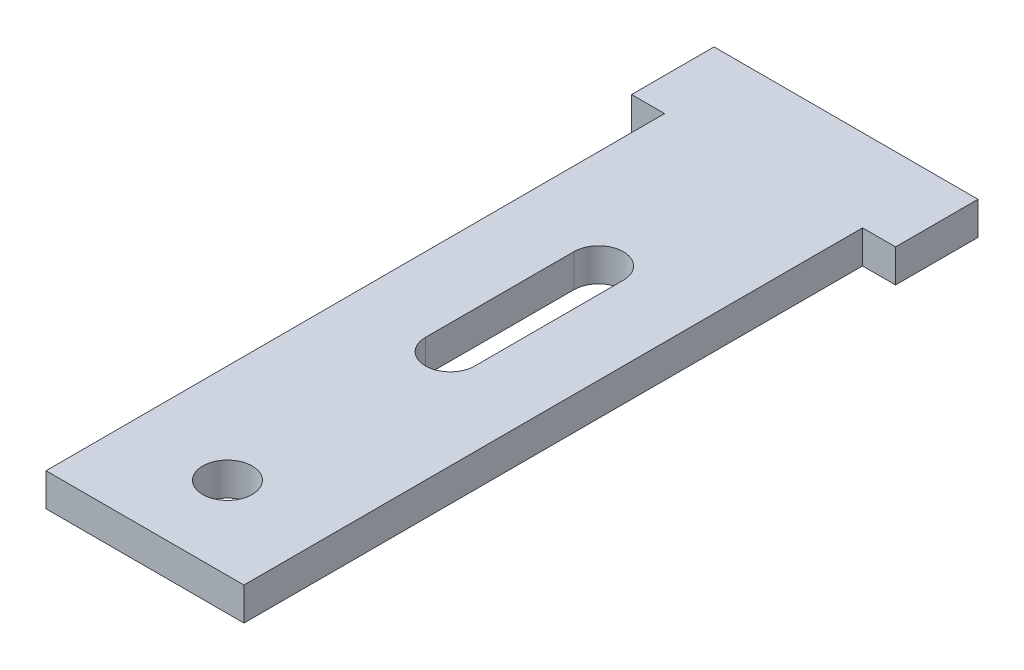
ISO-10303-21;
HEADER;
FILE_DESCRIPTION(('STEP AP214'),'2;1');
FILE_NAME('part.step','',(''),(''),'','','');
FILE_SCHEMA(('AUTOMOTIVE_DESIGN { 1 0 10303 214 1 1 1 1 }'));
ENDSEC;
DATA;
#1=APPLICATION_CONTEXT('core data for automotive mechanical design processes');
#2=APPLICATION_PROTOCOL_DEFINITION('international standard','automotive_design',2000,#1);
#3=PRODUCT_CONTEXT('',#1,'mechanical');
#4=PRODUCT('Part','Part','',(#3));
#5=PRODUCT_RELATED_PRODUCT_CATEGORY('part','',(#4));
#6=PRODUCT_DEFINITION_FORMATION('','',#4);
#7=PRODUCT_DEFINITION_CONTEXT('part definition',#1,'design');
#8=PRODUCT_DEFINITION('design','',#6,#7);
#9=PRODUCT_DEFINITION_SHAPE('','',#8);
#10=(LENGTH_UNIT() NAMED_UNIT(*) SI_UNIT(.MILLI.,.METRE.));
#11=(NAMED_UNIT(*) PLANE_ANGLE_UNIT() SI_UNIT($,.RADIAN.));
#12=(NAMED_UNIT(*) SI_UNIT($,.STERADIAN.) SOLID_ANGLE_UNIT());
#13=UNCERTAINTY_MEASURE_WITH_UNIT(LENGTH_MEASURE(1.E-05),#10,'distance_accuracy_value','');
#14=(GEOMETRIC_REPRESENTATION_CONTEXT(3) GLOBAL_UNCERTAINTY_ASSIGNED_CONTEXT((#13)) GLOBAL_UNIT_ASSIGNED_CONTEXT((#10,
#11,#12)) REPRESENTATION_CONTEXT('',''));
#15=CARTESIAN_POINT('',(0.,0.,0.));
#16=DIRECTION('',(0.,0.,1.));
#17=DIRECTION('',(1.,0.,0.));
#18=AXIS2_PLACEMENT_3D('',#15,#16,#17);
#19=CARTESIAN_POINT('',(0.,2.,0.));
#20=DIRECTION('',(0.,1.,0.));
#21=DIRECTION('',(0.,0.,1.));
#22=AXIS2_PLACEMENT_3D('',#19,#20,#21);
#23=PLANE('',#22);
#24=DIRECTION('',(0.,0.,1.));
#25=VECTOR('',#24,1.);
#26=CARTESIAN_POINT('',(-5.99999999999999,2.,15.7643000732223));
#27=LINE('',#26,#25);
#28=CARTESIAN_POINT('',(-5.99999999999998,2.,-21.7356999267777));
#29=VERTEX_POINT('',#28);
#30=CARTESIAN_POINT('',(-5.99999999999999,2.,15.7643000732223));
#31=VERTEX_POINT('',#30);
#32=EDGE_CURVE('E166',#29,#31,#27,.T.);
#33=ORIENTED_EDGE('',*,*,#32,.T.);
#34=DIRECTION('',(1.,0.,0.));
#35=VECTOR('',#34,1.);
#36=CARTESIAN_POINT('',(6.00000000000002,2.,15.7643000732223));
#37=LINE('',#36,#35);
#38=CARTESIAN_POINT('',(6.00000000000002,2.,15.7643000732223));
#39=VERTEX_POINT('',#38);
#40=EDGE_CURVE('E169',#31,#39,#37,.T.);
#41=ORIENTED_EDGE('',*,*,#40,.T.);
#42=DIRECTION('',(0.,0.,-1.));
#43=VECTOR('',#42,1.);
#44=CARTESIAN_POINT('',(6.00000000000002,2.,15.7643000732223));
#45=LINE('',#44,#43);
#46=CARTESIAN_POINT('',(6.00000000000001,2.,-21.7356999267777));
#47=VERTEX_POINT('',#46);
#48=EDGE_CURVE('E172',#39,#47,#45,.T.);
#49=ORIENTED_EDGE('',*,*,#48,.T.);
#50=DIRECTION('',(1.,0.,0.));
#51=VECTOR('',#50,1.);
#52=CARTESIAN_POINT('',(8.00000000000001,2.,-21.7356999267777));
#53=LINE('',#52,#51);
#54=CARTESIAN_POINT('',(8.00000000000001,2.,-21.7356999267777));
#55=VERTEX_POINT('',#54);
#56=EDGE_CURVE('E174',#47,#55,#53,.T.);
#57=ORIENTED_EDGE('',*,*,#56,.T.);
#58=DIRECTION('',(0.,0.,-1.));
#59=VECTOR('',#58,1.);
#60=CARTESIAN_POINT('',(8.00000000000001,2.,-26.7356999267777));
#61=LINE('',#60,#59);
#62=CARTESIAN_POINT('',(8.00000000000001,2.,-26.7356999267777));
#63=VERTEX_POINT('',#62);
#64=EDGE_CURVE('E176',#55,#63,#61,.T.);
#65=ORIENTED_EDGE('',*,*,#64,.T.);
#66=DIRECTION('',(-1.,0.,0.));
#67=VECTOR('',#66,1.);
#68=CARTESIAN_POINT('',(-7.99999999999999,2.,-26.7356999267777));
#69=LINE('',#68,#67);
#70=CARTESIAN_POINT('',(-7.99999999999999,2.,-26.7356999267777));
#71=VERTEX_POINT('',#70);
#72=EDGE_CURVE('E178',#63,#71,#69,.T.);
#73=ORIENTED_EDGE('',*,*,#72,.T.);
#74=DIRECTION('',(0.,0.,1.));
#75=VECTOR('',#74,1.);
#76=CARTESIAN_POINT('',(-7.99999999999999,2.,-21.7356999267777));
#77=LINE('',#76,#75);
#78=CARTESIAN_POINT('',(-7.99999999999999,2.,-21.7356999267777));
#79=VERTEX_POINT('',#78);
#80=EDGE_CURVE('E180',#71,#79,#77,.T.);
#81=ORIENTED_EDGE('',*,*,#80,.T.);
#82=DIRECTION('',(1.,0.,0.));
#83=VECTOR('',#82,1.);
#84=CARTESIAN_POINT('',(-5.99999999999998,2.,-21.7356999267777));
#85=LINE('',#84,#83);
#86=EDGE_CURVE('E182',#79,#29,#85,.T.);
#87=ORIENTED_EDGE('',*,*,#86,.T.);
#88=EDGE_LOOP('',(#33,#41,#49,#57,#65,#73,#81,#87));
#89=FACE_BOUND('',#88,.T.);
#90=CARTESIAN_POINT('',(0.,2.,10.7643000732223));
#91=DIRECTION('',(0.,1.,0.));
#92=DIRECTION('',(0.,0.,1.));
#93=AXIS2_PLACEMENT_3D('',#90,#91,#92);
#94=CIRCLE('',#93,1.5);
#95=CARTESIAN_POINT('',(0.,2.,12.2643000732223));
#96=VERTEX_POINT('',#95);
#97=EDGE_CURVE('E160',#96,#96,#94,.T.);
#98=ORIENTED_EDGE('',*,*,#97,.F.);
#99=EDGE_LOOP('',(#98));
#100=FACE_BOUND('',#99,.T.);
#101=DIRECTION('',(0.,0.,1.));
#102=VECTOR('',#101,1.);
#103=CARTESIAN_POINT('',(-1.5,2.,-2.73569992677766));
#104=LINE('',#103,#102);
#105=CARTESIAN_POINT('',(-1.5,2.,-11.7356999267777));
#106=VERTEX_POINT('',#105);
#107=CARTESIAN_POINT('',(-1.5,2.,-2.73569992677766));
#108=VERTEX_POINT('',#107);
#109=EDGE_CURVE('E132',#106,#108,#104,.T.);
#110=ORIENTED_EDGE('',*,*,#109,.F.);
#111=CARTESIAN_POINT('',(0.,2.,-11.7356999267777));
#112=DIRECTION('',(0.,1.,0.));
#113=DIRECTION('',(0.,0.,-1.));
#114=AXIS2_PLACEMENT_3D('',#111,#112,#113);
#115=CIRCLE('',#114,1.5);
#116=CARTESIAN_POINT('',(1.5,2.,-11.7356999267777));
#117=VERTEX_POINT('',#116);
#118=EDGE_CURVE('E124',#117,#106,#115,.T.);
#119=ORIENTED_EDGE('',*,*,#118,.F.);
#120=DIRECTION('',(0.,0.,-1.));
#121=VECTOR('',#120,1.);
#122=CARTESIAN_POINT('',(1.5,2.,-2.73569992677766));
#123=LINE('',#122,#121);
#124=CARTESIAN_POINT('',(1.5,2.,-2.73569992677766));
#125=VERTEX_POINT('',#124);
#126=EDGE_CURVE('E146',#125,#117,#123,.T.);
#127=ORIENTED_EDGE('',*,*,#126,.F.);
#128=CARTESIAN_POINT('',(0.,2.,-2.73569992677766));
#129=DIRECTION('',(0.,1.,0.));
#130=DIRECTION('',(0.,0.,1.));
#131=AXIS2_PLACEMENT_3D('',#128,#129,#130);
#132=CIRCLE('',#131,1.5);
#133=EDGE_CURVE('E144',#108,#125,#132,.T.);
#134=ORIENTED_EDGE('',*,*,#133,.F.);
#135=EDGE_LOOP('',(#110,#119,#127,#134));
#136=FACE_BOUND('',#135,.T.);
#137=ADVANCED_FACE('F35',(#89,#100,#136),#23,.T.);
#138=CARTESIAN_POINT('',(0.,0.,0.));
#139=DIRECTION('',(0.,1.,0.));
#140=DIRECTION('',(0.,0.,1.));
#141=AXIS2_PLACEMENT_3D('',#138,#139,#140);
#142=PLANE('',#141);
#143=CARTESIAN_POINT('',(0.,0.,10.7643000732223));
#144=DIRECTION('',(0.,1.,0.));
#145=DIRECTION('',(0.,0.,1.));
#146=AXIS2_PLACEMENT_3D('',#143,#144,#145);
#147=CIRCLE('',#146,1.5);
#148=CARTESIAN_POINT('',(0.,0.,12.2643000732223));
#149=VERTEX_POINT('',#148);
#150=EDGE_CURVE('E140',#149,#149,#147,.T.);
#151=ORIENTED_EDGE('',*,*,#150,.T.);
#152=EDGE_LOOP('',(#151));
#153=FACE_BOUND('',#152,.T.);
#154=DIRECTION('',(0.,0.,1.));
#155=VECTOR('',#154,1.);
#156=CARTESIAN_POINT('',(-5.99999999999999,0.,15.7643000732223));
#157=LINE('',#156,#155);
#158=CARTESIAN_POINT('',(-5.99999999999998,0.,-21.7356999267777));
#159=VERTEX_POINT('',#158);
#160=CARTESIAN_POINT('',(-5.99999999999999,0.,15.7643000732223));
#161=VERTEX_POINT('',#160);
#162=EDGE_CURVE('E163',#159,#161,#157,.T.);
#163=ORIENTED_EDGE('',*,*,#162,.F.);
#164=DIRECTION('',(1.,0.,0.));
#165=VECTOR('',#164,1.);
#166=CARTESIAN_POINT('',(-5.99999999999998,0.,-21.7356999267777));
#167=LINE('',#166,#165);
#168=CARTESIAN_POINT('',(-7.99999999999999,0.,-21.7356999267777));
#169=VERTEX_POINT('',#168);
#170=EDGE_CURVE('E170',#169,#159,#167,.T.);
#171=ORIENTED_EDGE('',*,*,#170,.F.);
#172=DIRECTION('',(0.,0.,1.));
#173=VECTOR('',#172,1.);
#174=CARTESIAN_POINT('',(-7.99999999999999,0.,-21.7356999267777));
#175=LINE('',#174,#173);
#176=CARTESIAN_POINT('',(-7.99999999999999,0.,-26.7356999267777));
#177=VERTEX_POINT('',#176);
#178=EDGE_CURVE('E197',#177,#169,#175,.T.);
#179=ORIENTED_EDGE('',*,*,#178,.F.);
#180=DIRECTION('',(-1.,0.,0.));
#181=VECTOR('',#180,1.);
#182=CARTESIAN_POINT('',(-7.99999999999999,0.,-26.7356999267777));
#183=LINE('',#182,#181);
#184=CARTESIAN_POINT('',(8.00000000000001,0.,-26.7356999267777));
#185=VERTEX_POINT('',#184);
#186=EDGE_CURVE('E195',#185,#177,#183,.T.);
#187=ORIENTED_EDGE('',*,*,#186,.F.);
#188=DIRECTION('',(0.,0.,-1.));
#189=VECTOR('',#188,1.);
#190=CARTESIAN_POINT('',(8.00000000000001,0.,-26.7356999267777));
#191=LINE('',#190,#189);
#192=CARTESIAN_POINT('',(8.00000000000001,0.,-21.7356999267777));
#193=VERTEX_POINT('',#192);
#194=EDGE_CURVE('E193',#193,#185,#191,.T.);
#195=ORIENTED_EDGE('',*,*,#194,.F.);
#196=DIRECTION('',(1.,0.,0.));
#197=VECTOR('',#196,1.);
#198=CARTESIAN_POINT('',(8.00000000000001,0.,-21.7356999267777));
#199=LINE('',#198,#197);
#200=CARTESIAN_POINT('',(6.00000000000001,0.,-21.7356999267777));
#201=VERTEX_POINT('',#200);
#202=EDGE_CURVE('E191',#201,#193,#199,.T.);
#203=ORIENTED_EDGE('',*,*,#202,.F.);
#204=DIRECTION('',(0.,0.,-1.));
#205=VECTOR('',#204,1.);
#206=CARTESIAN_POINT('',(6.00000000000002,0.,15.7643000732223));
#207=LINE('',#206,#205);
#208=CARTESIAN_POINT('',(6.00000000000002,0.,15.7643000732223));
#209=VERTEX_POINT('',#208);
#210=EDGE_CURVE('E189',#209,#201,#207,.T.);
#211=ORIENTED_EDGE('',*,*,#210,.F.);
#212=DIRECTION('',(1.,0.,0.));
#213=VECTOR('',#212,1.);
#214=CARTESIAN_POINT('',(6.00000000000002,0.,15.7643000732223));
#215=LINE('',#214,#213);
#216=EDGE_CURVE('E187',#161,#209,#215,.T.);
#217=ORIENTED_EDGE('',*,*,#216,.F.);
#218=EDGE_LOOP('',(#163,#171,#179,#187,#195,#203,#211,#217));
#219=FACE_BOUND('',#218,.T.);
#220=CARTESIAN_POINT('',(0.,0.,-11.7356999267777));
#221=DIRECTION('',(0.,1.,0.));
#222=DIRECTION('',(0.,0.,-1.));
#223=AXIS2_PLACEMENT_3D('',#220,#221,#222);
#224=CIRCLE('',#223,1.5);
#225=CARTESIAN_POINT('',(1.5,0.,-11.7356999267777));
#226=VERTEX_POINT('',#225);
#227=CARTESIAN_POINT('',(-1.5,0.,-11.7356999267777));
#228=VERTEX_POINT('',#227);
#229=EDGE_CURVE('E58',#226,#228,#224,.T.);
#230=ORIENTED_EDGE('',*,*,#229,.T.);
#231=DIRECTION('',(0.,0.,1.));
#232=VECTOR('',#231,1.);
#233=CARTESIAN_POINT('',(-1.5,0.,-2.73569992677766));
#234=LINE('',#233,#232);
#235=CARTESIAN_POINT('',(-1.5,0.,-2.73569992677766));
#236=VERTEX_POINT('',#235);
#237=EDGE_CURVE('E139',#228,#236,#234,.T.);
#238=ORIENTED_EDGE('',*,*,#237,.T.);
#239=CARTESIAN_POINT('',(0.,0.,-2.73569992677766));
#240=DIRECTION('',(0.,1.,0.));
#241=DIRECTION('',(0.,0.,1.));
#242=AXIS2_PLACEMENT_3D('',#239,#240,#241);
#243=CIRCLE('',#242,1.5);
#244=CARTESIAN_POINT('',(1.5,0.,-2.73569992677766));
#245=VERTEX_POINT('',#244);
#246=EDGE_CURVE('E152',#236,#245,#243,.T.);
#247=ORIENTED_EDGE('',*,*,#246,.T.);
#248=DIRECTION('',(0.,0.,-1.));
#249=VECTOR('',#248,1.);
#250=CARTESIAN_POINT('',(1.5,0.,-2.73569992677766));
#251=LINE('',#250,#249);
#252=EDGE_CURVE('E133',#245,#226,#251,.T.);
#253=ORIENTED_EDGE('',*,*,#252,.T.);
#254=EDGE_LOOP('',(#230,#238,#247,#253));
#255=FACE_BOUND('',#254,.T.);
#256=ADVANCED_FACE('F227',(#153,#219,#255),#142,.F.);
#257=CARTESIAN_POINT('',(-5.99999999999999,2.,15.7643000732223));
#258=DIRECTION('',(1.,0.,0.));
#259=DIRECTION('',(0.,0.,-1.));
#260=AXIS2_PLACEMENT_3D('',#257,#258,#259);
#261=PLANE('',#260);
#262=ORIENTED_EDGE('',*,*,#162,.T.);
#263=DIRECTION('',(0.,-1.,0.));
#264=VECTOR('',#263,1.);
#265=CARTESIAN_POINT('',(-5.99999999999999,2.,15.7643000732223));
#266=LINE('',#265,#264);
#267=EDGE_CURVE('E11',#31,#161,#266,.T.);
#268=ORIENTED_EDGE('',*,*,#267,.F.);
#269=ORIENTED_EDGE('',*,*,#32,.F.);
#270=DIRECTION('',(0.,-1.,0.));
#271=VECTOR('',#270,1.);
#272=CARTESIAN_POINT('',(-5.99999999999998,2.,-21.7356999267777));
#273=LINE('',#272,#271);
#274=EDGE_CURVE('E184',#29,#159,#273,.T.);
#275=ORIENTED_EDGE('',*,*,#274,.T.);
#276=EDGE_LOOP('',(#262,#268,#269,#275));
#277=FACE_BOUND('',#276,.T.);
#278=ADVANCED_FACE('F37',(#277),#261,.F.);
#279=CARTESIAN_POINT('',(6.00000000000002,2.,15.7643000732223));
#280=DIRECTION('',(0.,0.,-1.));
#281=DIRECTION('',(-1.,0.,0.));
#282=AXIS2_PLACEMENT_3D('',#279,#280,#281);
#283=PLANE('',#282);
#284=ORIENTED_EDGE('',*,*,#216,.T.);
#285=DIRECTION('',(0.,-1.,0.));
#286=VECTOR('',#285,1.);
#287=CARTESIAN_POINT('',(6.00000000000002,2.,15.7643000732223));
#288=LINE('',#287,#286);
#289=EDGE_CURVE('E43',#39,#209,#288,.T.);
#290=ORIENTED_EDGE('',*,*,#289,.F.);
#291=ORIENTED_EDGE('',*,*,#40,.F.);
#292=ORIENTED_EDGE('',*,*,#267,.T.);
#293=EDGE_LOOP('',(#284,#290,#291,#292));
#294=FACE_BOUND('',#293,.T.);
#295=ADVANCED_FACE('F245',(#294),#283,.F.);
#296=CARTESIAN_POINT('',(6.00000000000002,2.,15.7643000732223));
#297=DIRECTION('',(-1.,0.,0.));
#298=DIRECTION('',(0.,0.,1.));
#299=AXIS2_PLACEMENT_3D('',#296,#297,#298);
#300=PLANE('',#299);
#301=ORIENTED_EDGE('',*,*,#210,.T.);
#302=DIRECTION('',(0.,-1.,0.));
#303=VECTOR('',#302,1.);
#304=CARTESIAN_POINT('',(6.00000000000001,2.,-21.7356999267777));
#305=LINE('',#304,#303);
#306=EDGE_CURVE('E214',#47,#201,#305,.T.);
#307=ORIENTED_EDGE('',*,*,#306,.F.);
#308=ORIENTED_EDGE('',*,*,#48,.F.);
#309=ORIENTED_EDGE('',*,*,#289,.T.);
#310=EDGE_LOOP('',(#301,#307,#308,#309));
#311=FACE_BOUND('',#310,.T.);
#312=ADVANCED_FACE('F221',(#311),#300,.F.);
#313=CARTESIAN_POINT('',(8.00000000000001,2.,-21.7356999267777));
#314=DIRECTION('',(0.,0.,-1.));
#315=DIRECTION('',(-1.,0.,0.));
#316=AXIS2_PLACEMENT_3D('',#313,#314,#315);
#317=PLANE('',#316);
#318=ORIENTED_EDGE('',*,*,#202,.T.);
#319=DIRECTION('',(0.,-1.,0.));
#320=VECTOR('',#319,1.);
#321=CARTESIAN_POINT('',(8.00000000000001,2.,-21.7356999267777));
#322=LINE('',#321,#320);
#323=EDGE_CURVE('E211',#55,#193,#322,.T.);
#324=ORIENTED_EDGE('',*,*,#323,.F.);
#325=ORIENTED_EDGE('',*,*,#56,.F.);
#326=ORIENTED_EDGE('',*,*,#306,.T.);
#327=EDGE_LOOP('',(#318,#324,#325,#326));
#328=FACE_BOUND('',#327,.T.);
#329=ADVANCED_FACE('F233',(#328),#317,.F.);
#330=CARTESIAN_POINT('',(8.00000000000001,2.,-26.7356999267777));
#331=DIRECTION('',(-1.,0.,0.));
#332=DIRECTION('',(0.,0.,1.));
#333=AXIS2_PLACEMENT_3D('',#330,#331,#332);
#334=PLANE('',#333);
#335=ORIENTED_EDGE('',*,*,#194,.T.);
#336=DIRECTION('',(0.,-1.,0.));
#337=VECTOR('',#336,1.);
#338=CARTESIAN_POINT('',(8.00000000000001,2.,-26.7356999267777));
#339=LINE('',#338,#337);
#340=EDGE_CURVE('E208',#63,#185,#339,.T.);
#341=ORIENTED_EDGE('',*,*,#340,.F.);
#342=ORIENTED_EDGE('',*,*,#64,.F.);
#343=ORIENTED_EDGE('',*,*,#323,.T.);
#344=EDGE_LOOP('',(#335,#341,#342,#343));
#345=FACE_BOUND('',#344,.T.);
#346=ADVANCED_FACE('F237',(#345),#334,.F.);
#347=CARTESIAN_POINT('',(-7.99999999999999,2.,-26.7356999267777));
#348=DIRECTION('',(0.,0.,1.));
#349=DIRECTION('',(1.,0.,0.));
#350=AXIS2_PLACEMENT_3D('',#347,#348,#349);
#351=PLANE('',#350);
#352=ORIENTED_EDGE('',*,*,#186,.T.);
#353=DIRECTION('',(0.,-1.,0.));
#354=VECTOR('',#353,1.);
#355=CARTESIAN_POINT('',(-7.99999999999999,2.,-26.7356999267777));
#356=LINE('',#355,#354);
#357=EDGE_CURVE('E205',#71,#177,#356,.T.);
#358=ORIENTED_EDGE('',*,*,#357,.F.);
#359=ORIENTED_EDGE('',*,*,#72,.F.);
#360=ORIENTED_EDGE('',*,*,#340,.T.);
#361=EDGE_LOOP('',(#352,#358,#359,#360));
#362=FACE_BOUND('',#361,.T.);
#363=ADVANCED_FACE('F258',(#362),#351,.F.);
#364=CARTESIAN_POINT('',(-7.99999999999999,2.,-21.7356999267777));
#365=DIRECTION('',(1.,0.,0.));
#366=DIRECTION('',(0.,0.,-1.));
#367=AXIS2_PLACEMENT_3D('',#364,#365,#366);
#368=PLANE('',#367);
#369=ORIENTED_EDGE('',*,*,#178,.T.);
#370=DIRECTION('',(0.,-1.,0.));
#371=VECTOR('',#370,1.);
#372=CARTESIAN_POINT('',(-7.99999999999999,2.,-21.7356999267777));
#373=LINE('',#372,#371);
#374=EDGE_CURVE('E202',#79,#169,#373,.T.);
#375=ORIENTED_EDGE('',*,*,#374,.F.);
#376=ORIENTED_EDGE('',*,*,#80,.F.);
#377=ORIENTED_EDGE('',*,*,#357,.T.);
#378=EDGE_LOOP('',(#369,#375,#376,#377));
#379=FACE_BOUND('',#378,.T.);
#380=ADVANCED_FACE('F256',(#379),#368,.F.);
#381=CARTESIAN_POINT('',(-5.99999999999998,2.,-21.7356999267777));
#382=DIRECTION('',(0.,0.,-1.));
#383=DIRECTION('',(-1.,0.,0.));
#384=AXIS2_PLACEMENT_3D('',#381,#382,#383);
#385=PLANE('',#384);
#386=ORIENTED_EDGE('',*,*,#170,.T.);
#387=ORIENTED_EDGE('',*,*,#274,.F.);
#388=ORIENTED_EDGE('',*,*,#86,.F.);
#389=ORIENTED_EDGE('',*,*,#374,.T.);
#390=EDGE_LOOP('',(#386,#387,#388,#389));
#391=FACE_BOUND('',#390,.T.);
#392=ADVANCED_FACE('F251',(#391),#385,.F.);
#393=CARTESIAN_POINT('',(0.,2.,10.7643000732223));
#394=DIRECTION('',(0.,-1.,0.));
#395=DIRECTION('',(0.,0.,-1.));
#396=AXIS2_PLACEMENT_3D('',#393,#394,#395);
#397=CYLINDRICAL_SURFACE('',#396,1.5);
#398=ORIENTED_EDGE('',*,*,#97,.T.);
#399=EDGE_LOOP('',(#398));
#400=FACE_BOUND('',#399,.T.);
#401=ORIENTED_EDGE('',*,*,#150,.F.);
#402=EDGE_LOOP('',(#401));
#403=FACE_BOUND('',#402,.T.);
#404=ADVANCED_FACE('F275',(#400,#403),#397,.F.);
#405=CARTESIAN_POINT('',(0.,2.,-11.7356999267777));
#406=DIRECTION('',(0.,-1.,0.));
#407=DIRECTION('',(0.,0.,-1.));
#408=AXIS2_PLACEMENT_3D('',#405,#406,#407);
#409=CYLINDRICAL_SURFACE('',#408,1.5);
#410=ORIENTED_EDGE('',*,*,#229,.F.);
#411=DIRECTION('',(0.,-1.,0.));
#412=VECTOR('',#411,1.);
#413=CARTESIAN_POINT('',(1.5,2.,-11.7356999267777));
#414=LINE('',#413,#412);
#415=EDGE_CURVE('E128',#117,#226,#414,.T.);
#416=ORIENTED_EDGE('',*,*,#415,.F.);
#417=ORIENTED_EDGE('',*,*,#118,.T.);
#418=DIRECTION('',(0.,-1.,0.));
#419=VECTOR('',#418,1.);
#420=CARTESIAN_POINT('',(-1.5,2.,-11.7356999267777));
#421=LINE('',#420,#419);
#422=EDGE_CURVE('E127',#106,#228,#421,.T.);
#423=ORIENTED_EDGE('',*,*,#422,.T.);
#424=EDGE_LOOP('',(#410,#416,#417,#423));
#425=FACE_BOUND('',#424,.T.);
#426=ADVANCED_FACE('F126',(#425),#409,.F.);
#427=CARTESIAN_POINT('',(-1.5,2.,-2.73569992677766));
#428=DIRECTION('',(1.,0.,0.));
#429=DIRECTION('',(0.,0.,-1.));
#430=AXIS2_PLACEMENT_3D('',#427,#428,#429);
#431=PLANE('',#430);
#432=ORIENTED_EDGE('',*,*,#237,.F.);
#433=ORIENTED_EDGE('',*,*,#422,.F.);
#434=ORIENTED_EDGE('',*,*,#109,.T.);
#435=DIRECTION('',(0.,-1.,0.));
#436=VECTOR('',#435,1.);
#437=CARTESIAN_POINT('',(-1.5,2.,-2.73569992677766));
#438=LINE('',#437,#436);
#439=EDGE_CURVE('E141',#108,#236,#438,.T.);
#440=ORIENTED_EDGE('',*,*,#439,.T.);
#441=EDGE_LOOP('',(#432,#433,#434,#440));
#442=FACE_BOUND('',#441,.T.);
#443=ADVANCED_FACE('F136',(#442),#431,.T.);
#444=CARTESIAN_POINT('',(0.,2.,-2.73569992677766));
#445=DIRECTION('',(0.,-1.,0.));
#446=DIRECTION('',(0.,0.,-1.));
#447=AXIS2_PLACEMENT_3D('',#444,#445,#446);
#448=CYLINDRICAL_SURFACE('',#447,1.5);
#449=ORIENTED_EDGE('',*,*,#246,.F.);
#450=ORIENTED_EDGE('',*,*,#439,.F.);
#451=ORIENTED_EDGE('',*,*,#133,.T.);
#452=DIRECTION('',(0.,-1.,0.));
#453=VECTOR('',#452,1.);
#454=CARTESIAN_POINT('',(1.5,2.,-2.73569992677766));
#455=LINE('',#454,#453);
#456=EDGE_CURVE('E50',#125,#245,#455,.T.);
#457=ORIENTED_EDGE('',*,*,#456,.T.);
#458=EDGE_LOOP('',(#449,#450,#451,#457));
#459=FACE_BOUND('',#458,.T.);
#460=ADVANCED_FACE('F292',(#459),#448,.F.);
#461=CARTESIAN_POINT('',(1.5,2.,-2.73569992677766));
#462=DIRECTION('',(-1.,0.,0.));
#463=DIRECTION('',(0.,0.,1.));
#464=AXIS2_PLACEMENT_3D('',#461,#462,#463);
#465=PLANE('',#464);
#466=ORIENTED_EDGE('',*,*,#252,.F.);
#467=ORIENTED_EDGE('',*,*,#456,.F.);
#468=ORIENTED_EDGE('',*,*,#126,.T.);
#469=ORIENTED_EDGE('',*,*,#415,.T.);
#470=EDGE_LOOP('',(#466,#467,#468,#469));
#471=FACE_BOUND('',#470,.T.);
#472=ADVANCED_FACE('F297',(#471),#465,.T.);
#473=CLOSED_SHELL('',(#137,#256,#278,#295,#312,#329,#346,#363,#380,#392,#404,#426,#443,#460,#472));
#474=MANIFOLD_SOLID_BREP('B2',#473);
#475=ADVANCED_BREP_SHAPE_REPRESENTATION('',(#18,#474),#14);
#476=SHAPE_DEFINITION_REPRESENTATION(#9,#475);
ENDSEC;
END-ISO-10303-21;
